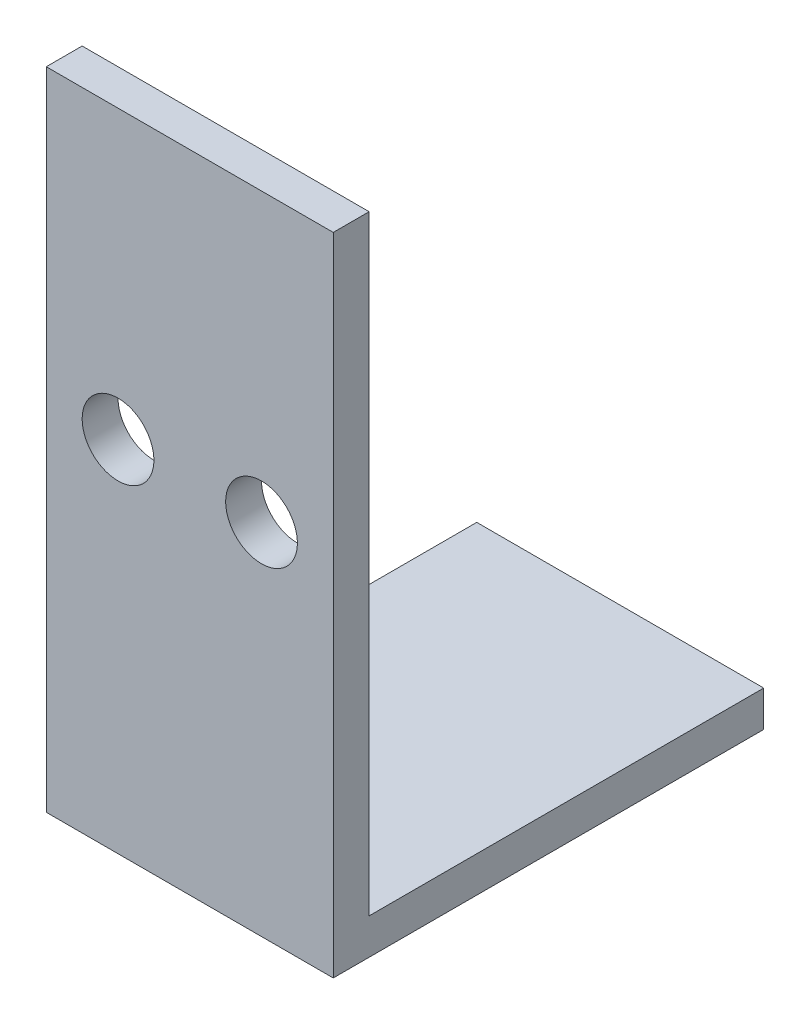
ISO-10303-21;
HEADER;
FILE_DESCRIPTION(('STEP AP214'),'2;1');
FILE_NAME('part.step','',(''),(''),'','','');
FILE_SCHEMA(('AUTOMOTIVE_DESIGN { 1 0 10303 214 1 1 1 1 }'));
ENDSEC;
DATA;
#1=APPLICATION_CONTEXT('core data for automotive mechanical design processes');
#2=APPLICATION_PROTOCOL_DEFINITION('international standard','automotive_design',2000,#1);
#3=PRODUCT_CONTEXT('',#1,'mechanical');
#4=PRODUCT('Part','Part','',(#3));
#5=PRODUCT_RELATED_PRODUCT_CATEGORY('part','',(#4));
#6=PRODUCT_DEFINITION_FORMATION('','',#4);
#7=PRODUCT_DEFINITION_CONTEXT('part definition',#1,'design');
#8=PRODUCT_DEFINITION('design','',#6,#7);
#9=PRODUCT_DEFINITION_SHAPE('','',#8);
#10=(LENGTH_UNIT() NAMED_UNIT(*) SI_UNIT(.MILLI.,.METRE.));
#11=(NAMED_UNIT(*) PLANE_ANGLE_UNIT() SI_UNIT($,.RADIAN.));
#12=(NAMED_UNIT(*) SI_UNIT($,.STERADIAN.) SOLID_ANGLE_UNIT());
#13=UNCERTAINTY_MEASURE_WITH_UNIT(LENGTH_MEASURE(1.E-05),#10,'distance_accuracy_value','');
#14=(GEOMETRIC_REPRESENTATION_CONTEXT(3) GLOBAL_UNCERTAINTY_ASSIGNED_CONTEXT((#13)) GLOBAL_UNIT_ASSIGNED_CONTEXT((#10,
#11,#12)) REPRESENTATION_CONTEXT('',''));
#15=CARTESIAN_POINT('',(0.,0.,0.));
#16=DIRECTION('',(0.,0.,1.));
#17=DIRECTION('',(1.,0.,0.));
#18=AXIS2_PLACEMENT_3D('',#15,#16,#17);
#19=CARTESIAN_POINT('',(25.4,0.,0.));
#20=DIRECTION('',(0.,0.,1.));
#21=DIRECTION('',(1.,0.,0.));
#22=AXIS2_PLACEMENT_3D('',#19,#20,#21);
#23=PLANE('',#22);
#24=CARTESIAN_POINT('',(6.35,31.75,0.));
#25=DIRECTION('',(0.,0.,-1.));
#26=DIRECTION('',(-1.,0.,0.));
#27=AXIS2_PLACEMENT_3D('',#24,#25,#26);
#28=CIRCLE('',#27,3.175);
#29=CARTESIAN_POINT('',(3.175,31.75,0.));
#30=VERTEX_POINT('',#29);
#31=EDGE_CURVE('E164',#30,#30,#28,.T.);
#32=ORIENTED_EDGE('',*,*,#31,.T.);
#33=EDGE_LOOP('',(#32));
#34=FACE_BOUND('',#33,.T.);
#35=CARTESIAN_POINT('',(19.05,31.75,0.));
#36=DIRECTION('',(0.,0.,-1.));
#37=DIRECTION('',(-1.,0.,0.));
#38=AXIS2_PLACEMENT_3D('',#35,#36,#37);
#39=CIRCLE('',#38,3.175);
#40=CARTESIAN_POINT('',(15.875,31.75,0.));
#41=VERTEX_POINT('',#40);
#42=EDGE_CURVE('E122',#41,#41,#39,.T.);
#43=ORIENTED_EDGE('',*,*,#42,.T.);
#44=EDGE_LOOP('',(#43));
#45=FACE_BOUND('',#44,.T.);
#46=DIRECTION('',(0.,1.,0.));
#47=VECTOR('',#46,1.);
#48=CARTESIAN_POINT('',(0.,0.,0.));
#49=LINE('',#48,#47);
#50=CARTESIAN_POINT('',(0.,0.,0.));
#51=VERTEX_POINT('',#50);
#52=CARTESIAN_POINT('',(0.,57.15,0.));
#53=VERTEX_POINT('',#52);
#54=EDGE_CURVE('E119',#51,#53,#49,.T.);
#55=ORIENTED_EDGE('',*,*,#54,.F.);
#56=DIRECTION('',(-1.,0.,0.));
#57=VECTOR('',#56,1.);
#58=CARTESIAN_POINT('',(25.4,0.,0.));
#59=LINE('',#58,#57);
#60=CARTESIAN_POINT('',(25.4,0.,0.));
#61=VERTEX_POINT('',#60);
#62=EDGE_CURVE('E11',#61,#51,#59,.T.);
#63=ORIENTED_EDGE('',*,*,#62,.F.);
#64=DIRECTION('',(0.,1.,0.));
#65=VECTOR('',#64,1.);
#66=CARTESIAN_POINT('',(25.4,0.,0.));
#67=LINE('',#66,#65);
#68=CARTESIAN_POINT('',(25.4,57.15,0.));
#69=VERTEX_POINT('',#68);
#70=EDGE_CURVE('E132',#61,#69,#67,.T.);
#71=ORIENTED_EDGE('',*,*,#70,.T.);
#72=DIRECTION('',(-1.,0.,0.));
#73=VECTOR('',#72,1.);
#74=CARTESIAN_POINT('',(25.4,57.15,0.));
#75=LINE('',#74,#73);
#76=EDGE_CURVE('E53',#69,#53,#75,.T.);
#77=ORIENTED_EDGE('',*,*,#76,.T.);
#78=EDGE_LOOP('',(#55,#63,#71,#77));
#79=FACE_BOUND('',#78,.T.);
#80=ADVANCED_FACE('F37',(#34,#45,#79),#23,.T.);
#81=CARTESIAN_POINT('',(25.4,0.,0.));
#82=DIRECTION('',(0.,1.,0.));
#83=DIRECTION('',(0.,0.,1.));
#84=AXIS2_PLACEMENT_3D('',#81,#82,#83);
#85=PLANE('',#84);
#86=DIRECTION('',(0.,0.,-1.));
#87=VECTOR('',#86,1.);
#88=CARTESIAN_POINT('',(0.,0.,0.));
#89=LINE('',#88,#87);
#90=CARTESIAN_POINT('',(0.,0.,-38.1));
#91=VERTEX_POINT('',#90);
#92=EDGE_CURVE('E121',#51,#91,#89,.T.);
#93=ORIENTED_EDGE('',*,*,#92,.T.);
#94=DIRECTION('',(-1.,0.,0.));
#95=VECTOR('',#94,1.);
#96=CARTESIAN_POINT('',(25.4,0.,-38.1));
#97=LINE('',#96,#95);
#98=CARTESIAN_POINT('',(25.4,0.,-38.1));
#99=VERTEX_POINT('',#98);
#100=EDGE_CURVE('E45',#99,#91,#97,.T.);
#101=ORIENTED_EDGE('',*,*,#100,.F.);
#102=DIRECTION('',(0.,0.,-1.));
#103=VECTOR('',#102,1.);
#104=CARTESIAN_POINT('',(25.4,0.,0.));
#105=LINE('',#104,#103);
#106=EDGE_CURVE('E177',#61,#99,#105,.T.);
#107=ORIENTED_EDGE('',*,*,#106,.F.);
#108=ORIENTED_EDGE('',*,*,#62,.T.);
#109=EDGE_LOOP('',(#93,#101,#107,#108));
#110=FACE_BOUND('',#109,.T.);
#111=ADVANCED_FACE('F156',(#110),#85,.F.);
#112=CARTESIAN_POINT('',(25.4,0.,-38.1));
#113=DIRECTION('',(0.,0.,1.));
#114=DIRECTION('',(1.,0.,0.));
#115=AXIS2_PLACEMENT_3D('',#112,#113,#114);
#116=PLANE('',#115);
#117=DIRECTION('',(0.,1.,0.));
#118=VECTOR('',#117,1.);
#119=CARTESIAN_POINT('',(0.,0.,-38.1));
#120=LINE('',#119,#118);
#121=CARTESIAN_POINT('',(0.,3.17499999999999,-38.1));
#122=VERTEX_POINT('',#121);
#123=EDGE_CURVE('E124',#91,#122,#120,.T.);
#124=ORIENTED_EDGE('',*,*,#123,.T.);
#125=DIRECTION('',(-1.,0.,0.));
#126=VECTOR('',#125,1.);
#127=CARTESIAN_POINT('',(25.4,3.17499999999999,-38.1));
#128=LINE('',#127,#126);
#129=CARTESIAN_POINT('',(25.4,3.17499999999999,-38.1));
#130=VERTEX_POINT('',#129);
#131=EDGE_CURVE('E111',#130,#122,#128,.T.);
#132=ORIENTED_EDGE('',*,*,#131,.F.);
#133=DIRECTION('',(0.,1.,0.));
#134=VECTOR('',#133,1.);
#135=CARTESIAN_POINT('',(25.4,0.,-38.1));
#136=LINE('',#135,#134);
#137=EDGE_CURVE('E99',#99,#130,#136,.T.);
#138=ORIENTED_EDGE('',*,*,#137,.F.);
#139=ORIENTED_EDGE('',*,*,#100,.T.);
#140=EDGE_LOOP('',(#124,#132,#138,#139));
#141=FACE_BOUND('',#140,.T.);
#142=ADVANCED_FACE('F139',(#141),#116,.F.);
#143=CARTESIAN_POINT('',(25.4,3.175,0.));
#144=DIRECTION('',(0.,-1.,0.));
#145=DIRECTION('',(0.,0.,-1.));
#146=AXIS2_PLACEMENT_3D('',#143,#144,#145);
#147=PLANE('',#146);
#148=DIRECTION('',(0.,0.,1.));
#149=VECTOR('',#148,1.);
#150=CARTESIAN_POINT('',(0.,3.175,0.));
#151=LINE('',#150,#149);
#152=CARTESIAN_POINT('',(0.,3.175,-3.175));
#153=VERTEX_POINT('',#152);
#154=EDGE_CURVE('E108',#122,#153,#151,.T.);
#155=ORIENTED_EDGE('',*,*,#154,.T.);
#156=DIRECTION('',(-1.,0.,0.));
#157=VECTOR('',#156,1.);
#158=CARTESIAN_POINT('',(25.4,3.175,-3.175));
#159=LINE('',#158,#157);
#160=CARTESIAN_POINT('',(25.4,3.175,-3.175));
#161=VERTEX_POINT('',#160);
#162=EDGE_CURVE('E105',#161,#153,#159,.T.);
#163=ORIENTED_EDGE('',*,*,#162,.F.);
#164=DIRECTION('',(0.,0.,1.));
#165=VECTOR('',#164,1.);
#166=CARTESIAN_POINT('',(25.4,3.175,0.));
#167=LINE('',#166,#165);
#168=EDGE_CURVE('E91',#130,#161,#167,.T.);
#169=ORIENTED_EDGE('',*,*,#168,.F.);
#170=ORIENTED_EDGE('',*,*,#131,.T.);
#171=EDGE_LOOP('',(#155,#163,#169,#170));
#172=FACE_BOUND('',#171,.T.);
#173=ADVANCED_FACE('F106',(#172),#147,.F.);
#174=CARTESIAN_POINT('',(25.4,0.,-3.175));
#175=DIRECTION('',(0.,0.,1.));
#176=DIRECTION('',(1.,0.,0.));
#177=AXIS2_PLACEMENT_3D('',#174,#175,#176);
#178=PLANE('',#177);
#179=CARTESIAN_POINT('',(6.35,31.75,-3.175));
#180=DIRECTION('',(0.,0.,-1.));
#181=DIRECTION('',(-1.,0.,0.));
#182=AXIS2_PLACEMENT_3D('',#179,#180,#181);
#183=CIRCLE('',#182,3.175);
#184=CARTESIAN_POINT('',(3.175,31.75,-3.175));
#185=VERTEX_POINT('',#184);
#186=EDGE_CURVE('E173',#185,#185,#183,.T.);
#187=ORIENTED_EDGE('',*,*,#186,.F.);
#188=EDGE_LOOP('',(#187));
#189=FACE_BOUND('',#188,.T.);
#190=CARTESIAN_POINT('',(19.05,31.75,-3.175));
#191=DIRECTION('',(0.,0.,-1.));
#192=DIRECTION('',(-1.,0.,0.));
#193=AXIS2_PLACEMENT_3D('',#190,#191,#192);
#194=CIRCLE('',#193,3.175);
#195=CARTESIAN_POINT('',(15.875,31.75,-3.175));
#196=VERTEX_POINT('',#195);
#197=EDGE_CURVE('E168',#196,#196,#194,.T.);
#198=ORIENTED_EDGE('',*,*,#197,.F.);
#199=EDGE_LOOP('',(#198));
#200=FACE_BOUND('',#199,.T.);
#201=DIRECTION('',(0.,1.,0.));
#202=VECTOR('',#201,1.);
#203=CARTESIAN_POINT('',(0.,0.,-3.175));
#204=LINE('',#203,#202);
#205=CARTESIAN_POINT('',(0.,57.15,-3.175));
#206=VERTEX_POINT('',#205);
#207=EDGE_CURVE('E127',#153,#206,#204,.T.);
#208=ORIENTED_EDGE('',*,*,#207,.T.);
#209=DIRECTION('',(-1.,0.,0.));
#210=VECTOR('',#209,1.);
#211=CARTESIAN_POINT('',(25.4,57.15,-3.175));
#212=LINE('',#211,#210);
#213=CARTESIAN_POINT('',(25.4,57.15,-3.175));
#214=VERTEX_POINT('',#213);
#215=EDGE_CURVE('E73',#214,#206,#212,.T.);
#216=ORIENTED_EDGE('',*,*,#215,.F.);
#217=DIRECTION('',(0.,1.,0.));
#218=VECTOR('',#217,1.);
#219=CARTESIAN_POINT('',(25.4,0.,-3.175));
#220=LINE('',#219,#218);
#221=EDGE_CURVE('E97',#161,#214,#220,.T.);
#222=ORIENTED_EDGE('',*,*,#221,.F.);
#223=ORIENTED_EDGE('',*,*,#162,.T.);
#224=EDGE_LOOP('',(#208,#216,#222,#223));
#225=FACE_BOUND('',#224,.T.);
#226=ADVANCED_FACE('F113',(#189,#200,#225),#178,.F.);
#227=CARTESIAN_POINT('',(25.4,57.15,0.));
#228=DIRECTION('',(0.,1.,0.));
#229=DIRECTION('',(0.,0.,1.));
#230=AXIS2_PLACEMENT_3D('',#227,#228,#229);
#231=PLANE('',#230);
#232=DIRECTION('',(0.,0.,-1.));
#233=VECTOR('',#232,1.);
#234=CARTESIAN_POINT('',(0.,57.15,0.));
#235=LINE('',#234,#233);
#236=EDGE_CURVE('E129',#53,#206,#235,.T.);
#237=ORIENTED_EDGE('',*,*,#236,.F.);
#238=ORIENTED_EDGE('',*,*,#76,.F.);
#239=DIRECTION('',(0.,0.,-1.));
#240=VECTOR('',#239,1.);
#241=CARTESIAN_POINT('',(25.4,57.15,0.));
#242=LINE('',#241,#240);
#243=EDGE_CURVE('E114',#69,#214,#242,.T.);
#244=ORIENTED_EDGE('',*,*,#243,.T.);
#245=ORIENTED_EDGE('',*,*,#215,.T.);
#246=EDGE_LOOP('',(#237,#238,#244,#245));
#247=FACE_BOUND('',#246,.T.);
#248=ADVANCED_FACE('F144',(#247),#231,.T.);
#249=CARTESIAN_POINT('',(25.4,0.,0.));
#250=DIRECTION('',(1.,0.,0.));
#251=DIRECTION('',(0.,0.,-1.));
#252=AXIS2_PLACEMENT_3D('',#249,#250,#251);
#253=PLANE('',#252);
#254=ORIENTED_EDGE('',*,*,#70,.F.);
#255=ORIENTED_EDGE('',*,*,#106,.T.);
#256=ORIENTED_EDGE('',*,*,#137,.T.);
#257=ORIENTED_EDGE('',*,*,#168,.T.);
#258=ORIENTED_EDGE('',*,*,#221,.T.);
#259=ORIENTED_EDGE('',*,*,#243,.F.);
#260=EDGE_LOOP('',(#254,#255,#256,#257,#258,#259));
#261=FACE_BOUND('',#260,.T.);
#262=ADVANCED_FACE('F94',(#261),#253,.T.);
#263=CARTESIAN_POINT('',(0.,0.,0.));
#264=DIRECTION('',(1.,0.,0.));
#265=DIRECTION('',(0.,0.,-1.));
#266=AXIS2_PLACEMENT_3D('',#263,#264,#265);
#267=PLANE('',#266);
#268=ORIENTED_EDGE('',*,*,#54,.T.);
#269=ORIENTED_EDGE('',*,*,#236,.T.);
#270=ORIENTED_EDGE('',*,*,#207,.F.);
#271=ORIENTED_EDGE('',*,*,#154,.F.);
#272=ORIENTED_EDGE('',*,*,#123,.F.);
#273=ORIENTED_EDGE('',*,*,#92,.F.);
#274=EDGE_LOOP('',(#268,#269,#270,#271,#272,#273));
#275=FACE_BOUND('',#274,.T.);
#276=ADVANCED_FACE('F143',(#275),#267,.F.);
#277=CARTESIAN_POINT('',(19.05,31.75,0.));
#278=DIRECTION('',(0.,0.,-1.));
#279=DIRECTION('',(-1.,0.,0.));
#280=AXIS2_PLACEMENT_3D('',#277,#278,#279);
#281=CYLINDRICAL_SURFACE('',#280,3.175);
#282=ORIENTED_EDGE('',*,*,#42,.F.);
#283=EDGE_LOOP('',(#282));
#284=FACE_BOUND('',#283,.T.);
#285=ORIENTED_EDGE('',*,*,#197,.T.);
#286=EDGE_LOOP('',(#285));
#287=FACE_BOUND('',#286,.T.);
#288=ADVANCED_FACE('F185',(#284,#287),#281,.F.);
#289=CARTESIAN_POINT('',(6.35,31.75,0.));
#290=DIRECTION('',(0.,0.,-1.));
#291=DIRECTION('',(-1.,0.,0.));
#292=AXIS2_PLACEMENT_3D('',#289,#290,#291);
#293=CYLINDRICAL_SURFACE('',#292,3.175);
#294=ORIENTED_EDGE('',*,*,#31,.F.);
#295=EDGE_LOOP('',(#294));
#296=FACE_BOUND('',#295,.T.);
#297=ORIENTED_EDGE('',*,*,#186,.T.);
#298=EDGE_LOOP('',(#297));
#299=FACE_BOUND('',#298,.T.);
#300=ADVANCED_FACE('F181',(#296,#299),#293,.F.);
#301=CLOSED_SHELL('',(#80,#111,#142,#173,#226,#248,#262,#276,#288,#300));
#302=MANIFOLD_SOLID_BREP('B2',#301);
#303=ADVANCED_BREP_SHAPE_REPRESENTATION('',(#18,#302),#14);
#304=SHAPE_DEFINITION_REPRESENTATION(#9,#303);
ENDSEC;
END-ISO-10303-21;
